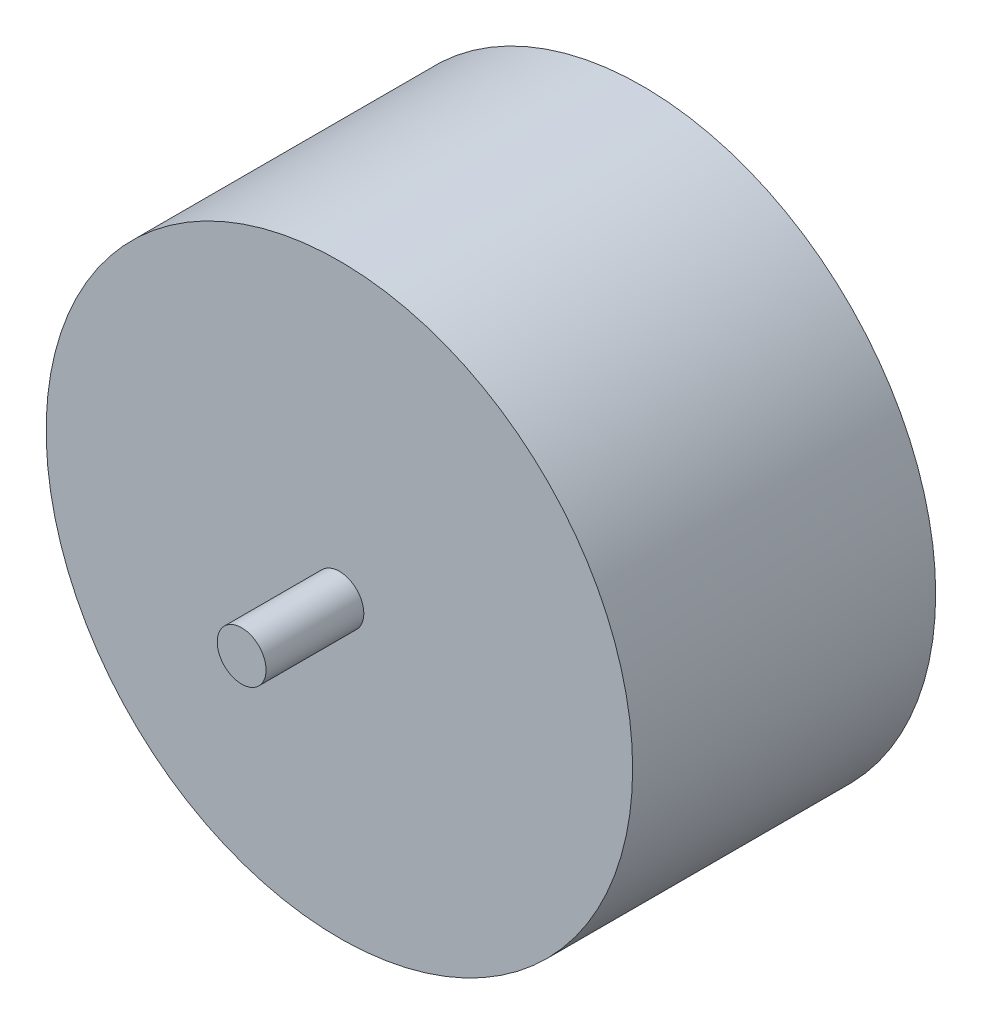
ISO-10303-21;
HEADER;
FILE_DESCRIPTION(('STEP AP214'),'2;1');
FILE_NAME('part.step','',(''),(''),'','','');
FILE_SCHEMA(('AUTOMOTIVE_DESIGN { 1 0 10303 214 1 1 1 1 }'));
ENDSEC;
DATA;
#1=APPLICATION_CONTEXT('core data for automotive mechanical design processes');
#2=APPLICATION_PROTOCOL_DEFINITION('international standard','automotive_design',2000,#1);
#3=PRODUCT_CONTEXT('',#1,'mechanical');
#4=PRODUCT('Part','Part','',(#3));
#5=PRODUCT_RELATED_PRODUCT_CATEGORY('part','',(#4));
#6=PRODUCT_DEFINITION_FORMATION('','',#4);
#7=PRODUCT_DEFINITION_CONTEXT('part definition',#1,'design');
#8=PRODUCT_DEFINITION('design','',#6,#7);
#9=PRODUCT_DEFINITION_SHAPE('','',#8);
#10=(LENGTH_UNIT() NAMED_UNIT(*) SI_UNIT(.MILLI.,.METRE.));
#11=(NAMED_UNIT(*) PLANE_ANGLE_UNIT() SI_UNIT($,.RADIAN.));
#12=(NAMED_UNIT(*) SI_UNIT($,.STERADIAN.) SOLID_ANGLE_UNIT());
#13=UNCERTAINTY_MEASURE_WITH_UNIT(LENGTH_MEASURE(1.E-05),#10,'distance_accuracy_value','');
#14=(GEOMETRIC_REPRESENTATION_CONTEXT(3) GLOBAL_UNCERTAINTY_ASSIGNED_CONTEXT((#13)) GLOBAL_UNIT_ASSIGNED_CONTEXT((#10,
#11,#12)) REPRESENTATION_CONTEXT('',''));
#15=CARTESIAN_POINT('',(0.,0.,0.));
#16=DIRECTION('',(0.,0.,1.));
#17=DIRECTION('',(1.,0.,0.));
#18=AXIS2_PLACEMENT_3D('',#15,#16,#17);
#19=CARTESIAN_POINT('',(0.,0.,31.));
#20=DIRECTION('',(0.,0.,-1.));
#21=DIRECTION('',(-1.,0.,0.));
#22=AXIS2_PLACEMENT_3D('',#19,#20,#21);
#23=CYLINDRICAL_SURFACE('',#22,30.);
#24=CARTESIAN_POINT('',(0.,0.,31.));
#25=DIRECTION('',(0.,0.,1.));
#26=DIRECTION('',(1.,0.,0.));
#27=AXIS2_PLACEMENT_3D('',#24,#25,#26);
#28=CIRCLE('',#27,30.);
#29=CARTESIAN_POINT('',(30.,0.,31.));
#30=VERTEX_POINT('',#29);
#31=EDGE_CURVE('E10',#30,#30,#28,.T.);
#32=ORIENTED_EDGE('',*,*,#31,.F.);
#33=EDGE_LOOP('',(#32));
#34=FACE_BOUND('',#33,.T.);
#35=CARTESIAN_POINT('',(0.,0.,0.));
#36=DIRECTION('',(0.,0.,1.));
#37=DIRECTION('',(1.,0.,0.));
#38=AXIS2_PLACEMENT_3D('',#35,#36,#37);
#39=CIRCLE('',#38,30.);
#40=CARTESIAN_POINT('',(30.,0.,0.));
#41=VERTEX_POINT('',#40);
#42=EDGE_CURVE('E36',#41,#41,#39,.T.);
#43=ORIENTED_EDGE('',*,*,#42,.T.);
#44=EDGE_LOOP('',(#43));
#45=FACE_BOUND('',#44,.T.);
#46=ADVANCED_FACE('F33',(#34,#45),#23,.T.);
#47=CARTESIAN_POINT('',(0.,0.,31.));
#48=DIRECTION('',(0.,0.,1.));
#49=DIRECTION('',(1.,0.,0.));
#50=AXIS2_PLACEMENT_3D('',#47,#48,#49);
#51=PLANE('',#50);
#52=CARTESIAN_POINT('',(0.,0.,31.));
#53=DIRECTION('',(0.,0.,1.));
#54=DIRECTION('',(1.,0.,0.));
#55=AXIS2_PLACEMENT_3D('',#52,#53,#54);
#56=CIRCLE('',#55,2.5);
#57=CARTESIAN_POINT('',(2.5,0.,31.));
#58=VERTEX_POINT('',#57);
#59=EDGE_CURVE('E45',#58,#58,#56,.T.);
#60=ORIENTED_EDGE('',*,*,#59,.F.);
#61=EDGE_LOOP('',(#60));
#62=FACE_BOUND('',#61,.T.);
#63=ORIENTED_EDGE('',*,*,#31,.T.);
#64=EDGE_LOOP('',(#63));
#65=FACE_BOUND('',#64,.T.);
#66=ADVANCED_FACE('F60',(#62,#65),#51,.T.);
#67=CARTESIAN_POINT('',(0.,0.,0.));
#68=DIRECTION('',(0.,0.,1.));
#69=DIRECTION('',(1.,0.,0.));
#70=AXIS2_PLACEMENT_3D('',#67,#68,#69);
#71=PLANE('',#70);
#72=ORIENTED_EDGE('',*,*,#42,.F.);
#73=EDGE_LOOP('',(#72));
#74=FACE_BOUND('',#73,.T.);
#75=ADVANCED_FACE('F56',(#74),#71,.F.);
#76=CARTESIAN_POINT('',(0.,0.,41.));
#77=DIRECTION('',(0.,0.,-1.));
#78=DIRECTION('',(-1.,0.,0.));
#79=AXIS2_PLACEMENT_3D('',#76,#77,#78);
#80=CYLINDRICAL_SURFACE('',#79,2.5);
#81=CARTESIAN_POINT('',(0.,0.,41.));
#82=DIRECTION('',(0.,0.,1.));
#83=DIRECTION('',(1.,0.,0.));
#84=AXIS2_PLACEMENT_3D('',#81,#82,#83);
#85=CIRCLE('',#84,2.5);
#86=CARTESIAN_POINT('',(2.5,0.,41.));
#87=VERTEX_POINT('',#86);
#88=EDGE_CURVE('E43',#87,#87,#85,.T.);
#89=ORIENTED_EDGE('',*,*,#88,.F.);
#90=EDGE_LOOP('',(#89));
#91=FACE_BOUND('',#90,.T.);
#92=ORIENTED_EDGE('',*,*,#59,.T.);
#93=EDGE_LOOP('',(#92));
#94=FACE_BOUND('',#93,.T.);
#95=ADVANCED_FACE('F53',(#91,#94),#80,.T.);
#96=CARTESIAN_POINT('',(0.,0.,41.));
#97=DIRECTION('',(0.,0.,1.));
#98=DIRECTION('',(1.,0.,0.));
#99=AXIS2_PLACEMENT_3D('',#96,#97,#98);
#100=PLANE('',#99);
#101=ORIENTED_EDGE('',*,*,#88,.T.);
#102=EDGE_LOOP('',(#101));
#103=FACE_BOUND('',#102,.T.);
#104=ADVANCED_FACE('F51',(#103),#100,.T.);
#105=CLOSED_SHELL('',(#46,#66,#75,#95,#104));
#106=MANIFOLD_SOLID_BREP('B2',#105);
#107=ADVANCED_BREP_SHAPE_REPRESENTATION('',(#18,#106),#14);
#108=SHAPE_DEFINITION_REPRESENTATION(#9,#107);
ENDSEC;
END-ISO-10303-21;
